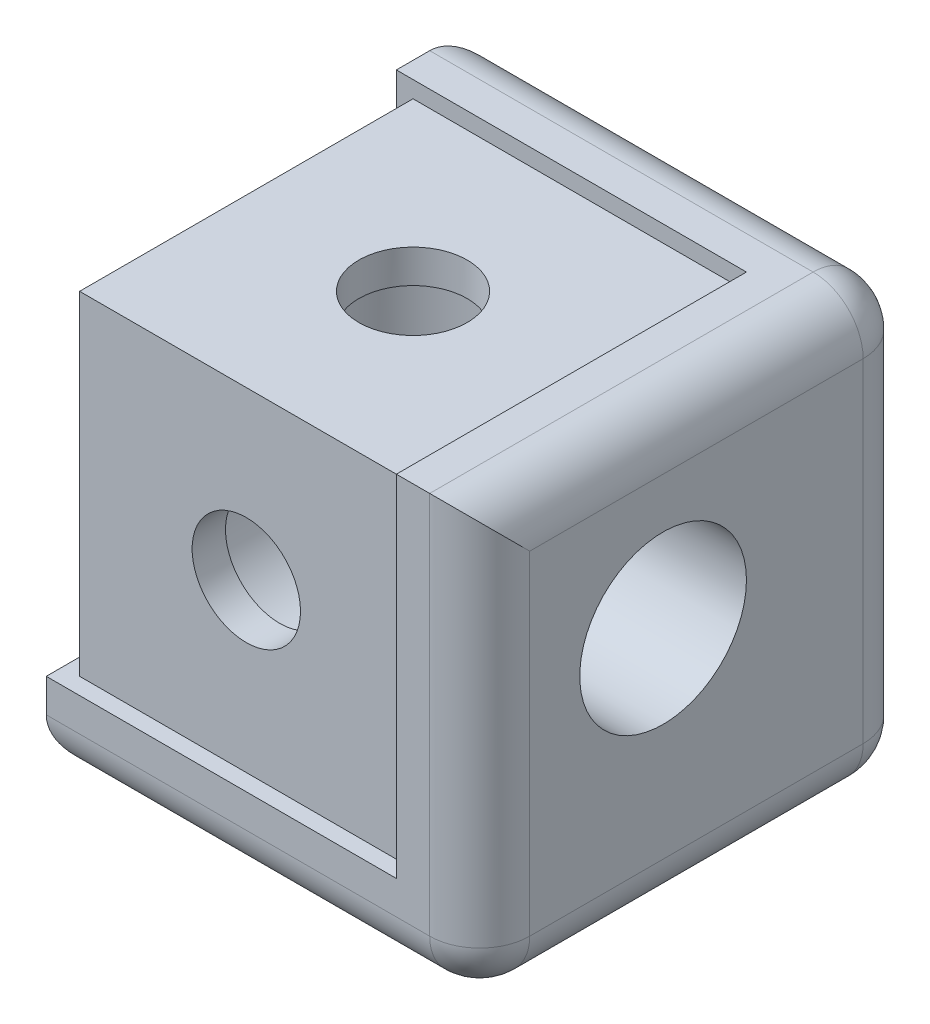
ISO-10303-21;
HEADER;
FILE_DESCRIPTION(('STEP AP214'),'2;1');
FILE_NAME('part.step','',(''),(''),'','','');
FILE_SCHEMA(('AUTOMOTIVE_DESIGN { 1 0 10303 214 1 1 1 1 }'));
ENDSEC;
DATA;
#1=APPLICATION_CONTEXT('core data for automotive mechanical design processes');
#2=APPLICATION_PROTOCOL_DEFINITION('international standard','automotive_design',2000,#1);
#3=PRODUCT_CONTEXT('',#1,'mechanical');
#4=PRODUCT('Part','Part','',(#3));
#5=PRODUCT_RELATED_PRODUCT_CATEGORY('part','',(#4));
#6=PRODUCT_DEFINITION_FORMATION('','',#4);
#7=PRODUCT_DEFINITION_CONTEXT('part definition',#1,'design');
#8=PRODUCT_DEFINITION('design','',#6,#7);
#9=PRODUCT_DEFINITION_SHAPE('','',#8);
#10=(LENGTH_UNIT() NAMED_UNIT(*) SI_UNIT(.MILLI.,.METRE.));
#11=(NAMED_UNIT(*) PLANE_ANGLE_UNIT() SI_UNIT($,.RADIAN.));
#12=(NAMED_UNIT(*) SI_UNIT($,.STERADIAN.) SOLID_ANGLE_UNIT());
#13=UNCERTAINTY_MEASURE_WITH_UNIT(LENGTH_MEASURE(1.E-05),#10,'distance_accuracy_value','');
#14=(GEOMETRIC_REPRESENTATION_CONTEXT(3) GLOBAL_UNCERTAINTY_ASSIGNED_CONTEXT((#13)) GLOBAL_UNIT_ASSIGNED_CONTEXT((#10,
#11,#12)) REPRESENTATION_CONTEXT('',''));
#15=CARTESIAN_POINT('',(0.,0.,0.));
#16=DIRECTION('',(0.,0.,1.));
#17=DIRECTION('',(1.,0.,0.));
#18=AXIS2_PLACEMENT_3D('',#15,#16,#17);
#19=CARTESIAN_POINT('',(0.,25.,0.));
#20=DIRECTION('',(0.,-1.,0.));
#21=DIRECTION('',(0.,0.,-1.));
#22=AXIS2_PLACEMENT_3D('',#19,#20,#21);
#23=PLANE('',#22);
#24=CARTESIAN_POINT('',(10.,25.,-10.));
#25=DIRECTION('',(0.,1.,0.));
#26=DIRECTION('',(0.,0.,1.));
#27=AXIS2_PLACEMENT_3D('',#24,#25,#26);
#28=CIRCLE('',#27,3.25);
#29=CARTESIAN_POINT('',(10.,25.,-6.75));
#30=VERTEX_POINT('',#29);
#31=EDGE_CURVE('E278',#30,#30,#28,.T.);
#32=ORIENTED_EDGE('',*,*,#31,.F.);
#33=EDGE_LOOP('',(#32));
#34=FACE_BOUND('',#33,.T.);
#35=DIRECTION('',(0.,0.,1.));
#36=VECTOR('',#35,1.);
#37=CARTESIAN_POINT('',(20.,25.,0.));
#38=LINE('',#37,#36);
#39=CARTESIAN_POINT('',(20.,25.,-20.));
#40=VERTEX_POINT('',#39);
#41=CARTESIAN_POINT('',(20.,25.,0.));
#42=VERTEX_POINT('',#41);
#43=EDGE_CURVE('E212',#40,#42,#38,.T.);
#44=ORIENTED_EDGE('',*,*,#43,.F.);
#45=DIRECTION('',(1.,0.,0.));
#46=VECTOR('',#45,1.);
#47=CARTESIAN_POINT('',(20.,25.,-20.));
#48=LINE('',#47,#46);
#49=CARTESIAN_POINT('',(0.,25.,-20.));
#50=VERTEX_POINT('',#49);
#51=EDGE_CURVE('E181',#50,#40,#48,.T.);
#52=ORIENTED_EDGE('',*,*,#51,.F.);
#53=DIRECTION('',(0.,0.,1.));
#54=VECTOR('',#53,1.);
#55=CARTESIAN_POINT('',(0.,25.,0.));
#56=LINE('',#55,#54);
#57=CARTESIAN_POINT('',(0.,25.,0.));
#58=VERTEX_POINT('',#57);
#59=EDGE_CURVE('E281',#50,#58,#56,.T.);
#60=ORIENTED_EDGE('',*,*,#59,.T.);
#61=DIRECTION('',(1.,0.,0.));
#62=VECTOR('',#61,1.);
#63=CARTESIAN_POINT('',(0.,25.,0.));
#64=LINE('',#63,#62);
#65=EDGE_CURVE('E283',#58,#42,#64,.T.);
#66=ORIENTED_EDGE('',*,*,#65,.T.);
#67=EDGE_LOOP('',(#44,#52,#60,#66));
#68=FACE_BOUND('',#67,.T.);
#69=ADVANCED_FACE('F35',(#34,#68),#23,.F.);
#70=CARTESIAN_POINT('',(0.,25.,0.));
#71=DIRECTION('',(0.,0.,-1.));
#72=DIRECTION('',(-1.,0.,0.));
#73=AXIS2_PLACEMENT_3D('',#70,#71,#72);
#74=PLANE('',#73);
#75=CARTESIAN_POINT('',(10.,15.,0.));
#76=DIRECTION('',(0.,0.,1.));
#77=DIRECTION('',(1.,0.,0.));
#78=AXIS2_PLACEMENT_3D('',#75,#76,#77);
#79=CIRCLE('',#78,3.25);
#80=CARTESIAN_POINT('',(13.25,15.,0.));
#81=VERTEX_POINT('',#80);
#82=EDGE_CURVE('E272',#81,#81,#79,.T.);
#83=ORIENTED_EDGE('',*,*,#82,.F.);
#84=EDGE_LOOP('',(#83));
#85=FACE_BOUND('',#84,.T.);
#86=DIRECTION('',(-1.,0.,0.));
#87=VECTOR('',#86,1.);
#88=CARTESIAN_POINT('',(20.,5.,0.));
#89=LINE('',#88,#87);
#90=CARTESIAN_POINT('',(20.,5.,0.));
#91=VERTEX_POINT('',#90);
#92=CARTESIAN_POINT('',(0.,5.,0.));
#93=VERTEX_POINT('',#92);
#94=EDGE_CURVE('E225',#91,#93,#89,.T.);
#95=ORIENTED_EDGE('',*,*,#94,.F.);
#96=DIRECTION('',(0.,-1.,0.));
#97=VECTOR('',#96,1.);
#98=CARTESIAN_POINT('',(20.,25.,0.));
#99=LINE('',#98,#97);
#100=EDGE_CURVE('E221',#42,#91,#99,.T.);
#101=ORIENTED_EDGE('',*,*,#100,.F.);
#102=ORIENTED_EDGE('',*,*,#65,.F.);
#103=DIRECTION('',(0.,-1.,0.));
#104=VECTOR('',#103,1.);
#105=CARTESIAN_POINT('',(0.,25.,0.));
#106=LINE('',#105,#104);
#107=EDGE_CURVE('E286',#58,#93,#106,.T.);
#108=ORIENTED_EDGE('',*,*,#107,.T.);
#109=EDGE_LOOP('',(#95,#101,#102,#108));
#110=FACE_BOUND('',#109,.T.);
#111=ADVANCED_FACE('F410',(#85,#110),#74,.F.);
#112=CARTESIAN_POINT('',(10.,0.,-10.));
#113=DIRECTION('',(0.,1.,0.));
#114=DIRECTION('',(0.,0.,1.));
#115=AXIS2_PLACEMENT_3D('',#112,#113,#114);
#116=CYLINDRICAL_SURFACE('',#115,3.25);
#117=ORIENTED_EDGE('',*,*,#31,.T.);
#118=EDGE_LOOP('',(#117));
#119=FACE_BOUND('',#118,.T.);
#120=CARTESIAN_POINT('',(10.,23.,-10.));
#121=DIRECTION('',(0.,-1.,0.));
#122=DIRECTION('',(0.,0.,-1.));
#123=AXIS2_PLACEMENT_3D('',#120,#121,#122);
#124=CIRCLE('',#123,3.25);
#125=CARTESIAN_POINT('',(10.,23.,-13.25));
#126=VERTEX_POINT('',#125);
#127=EDGE_CURVE('E257',#126,#126,#124,.F.);
#128=ORIENTED_EDGE('',*,*,#127,.F.);
#129=EDGE_LOOP('',(#128));
#130=FACE_BOUND('',#129,.T.);
#131=ADVANCED_FACE('F475',(#119,#130),#116,.F.);
#132=CARTESIAN_POINT('',(25.,15.,-10.));
#133=DIRECTION('',(-1.,0.,0.));
#134=DIRECTION('',(0.,0.,1.));
#135=AXIS2_PLACEMENT_3D('',#132,#133,#134);
#136=CYLINDRICAL_SURFACE('',#135,3.25);
#137=CARTESIAN_POINT('',(0.,15.,-10.));
#138=DIRECTION('',(-1.,0.,0.));
#139=DIRECTION('',(0.,0.,1.));
#140=AXIS2_PLACEMENT_3D('',#137,#138,#139);
#141=CIRCLE('',#140,3.25);
#142=CARTESIAN_POINT('',(0.,15.,-6.75));
#143=VERTEX_POINT('',#142);
#144=EDGE_CURVE('E275',#143,#143,#141,.T.);
#145=ORIENTED_EDGE('',*,*,#144,.T.);
#146=EDGE_LOOP('',(#145));
#147=FACE_BOUND('',#146,.T.);
#148=CARTESIAN_POINT('',(2.,15.,-10.));
#149=DIRECTION('',(1.,0.,0.));
#150=DIRECTION('',(0.,0.,-1.));
#151=AXIS2_PLACEMENT_3D('',#148,#149,#150);
#152=CIRCLE('',#151,3.25);
#153=CARTESIAN_POINT('',(2.,15.,-13.25));
#154=VERTEX_POINT('',#153);
#155=EDGE_CURVE('E261',#154,#154,#152,.F.);
#156=ORIENTED_EDGE('',*,*,#155,.F.);
#157=EDGE_LOOP('',(#156));
#158=FACE_BOUND('',#157,.T.);
#159=ADVANCED_FACE('F724',(#147,#158),#136,.F.);
#160=CARTESIAN_POINT('',(10.,15.,-2.00000000000001));
#161=DIRECTION('',(0.,0.,-1.));
#162=DIRECTION('',(-1.,0.,0.));
#163=AXIS2_PLACEMENT_3D('',#160,#161,#162);
#164=CYLINDRICAL_SURFACE('',#163,5.);
#165=CARTESIAN_POINT('',(10.,15.,-25.));
#166=DIRECTION('',(0.,0.,-1.));
#167=DIRECTION('',(-1.,0.,0.));
#168=AXIS2_PLACEMENT_3D('',#165,#166,#167);
#169=CIRCLE('',#168,5.);
#170=CARTESIAN_POINT('',(5.,15.,-25.));
#171=VERTEX_POINT('',#170);
#172=EDGE_CURVE('E269',#171,#171,#169,.T.);
#173=ORIENTED_EDGE('',*,*,#172,.T.);
#174=EDGE_LOOP('',(#173));
#175=FACE_BOUND('',#174,.T.);
#176=CARTESIAN_POINT('',(10.,15.,-10.));
#177=DIRECTION('',(-0.707106781186547,0.,-0.707106781186547));
#178=DIRECTION('',(0.707106781186547,0.,-0.707106781186547));
#179=AXIS2_PLACEMENT_3D('',#176,#177,#178);
#180=ELLIPSE('',#179,7.07106781186547,5.);
#181=CARTESIAN_POINT('',(13.5355339059327,11.4644660940673,-13.5355339059327));
#182=VERTEX_POINT('',#181);
#183=CARTESIAN_POINT('',(13.5355339059327,18.5355339059327,-13.5355339059327));
#184=VERTEX_POINT('',#183);
#185=EDGE_CURVE('E289',#182,#184,#180,.F.);
#186=ORIENTED_EDGE('',*,*,#185,.T.);
#187=CARTESIAN_POINT('',(10.,15.,-10.));
#188=DIRECTION('',(0.,-0.707106781186547,-0.707106781186547));
#189=DIRECTION('',(0.,0.707106781186547,-0.707106781186547));
#190=AXIS2_PLACEMENT_3D('',#187,#188,#189);
#191=ELLIPSE('',#190,7.07106781186548,5.);
#192=CARTESIAN_POINT('',(6.46446609406726,18.5355339059327,-13.5355339059327));
#193=VERTEX_POINT('',#192);
#194=EDGE_CURVE('E242',#184,#193,#191,.F.);
#195=ORIENTED_EDGE('',*,*,#194,.T.);
#196=CARTESIAN_POINT('',(10.,15.,-10.));
#197=DIRECTION('',(0.707106781186547,0.,-0.707106781186547));
#198=DIRECTION('',(-0.707106781186547,0.,-0.707106781186547));
#199=AXIS2_PLACEMENT_3D('',#196,#197,#198);
#200=ELLIPSE('',#199,7.07106781186547,5.);
#201=CARTESIAN_POINT('',(6.46446609406726,11.4644660940673,-13.5355339059327));
#202=VERTEX_POINT('',#201);
#203=EDGE_CURVE('E300',#193,#202,#200,.F.);
#204=ORIENTED_EDGE('',*,*,#203,.T.);
#205=CARTESIAN_POINT('',(10.,15.,-10.));
#206=DIRECTION('',(0.,0.707106781186547,-0.707106781186547));
#207=DIRECTION('',(0.,-0.707106781186547,-0.707106781186547));
#208=AXIS2_PLACEMENT_3D('',#205,#206,#207);
#209=ELLIPSE('',#208,7.07106781186548,5.);
#210=EDGE_CURVE('E251',#202,#182,#209,.F.);
#211=ORIENTED_EDGE('',*,*,#210,.T.);
#212=EDGE_LOOP('',(#186,#195,#204,#211));
#213=FACE_BOUND('',#212,.T.);
#214=ADVANCED_FACE('F714',(#175,#213),#164,.F.);
#215=CARTESIAN_POINT('',(10.,15.,-25.));
#216=DIRECTION('',(0.,0.,1.));
#217=DIRECTION('',(1.,0.,0.));
#218=AXIS2_PLACEMENT_3D('',#215,#216,#217);
#219=CYLINDRICAL_SURFACE('',#218,3.25);
#220=ORIENTED_EDGE('',*,*,#82,.T.);
#221=EDGE_LOOP('',(#220));
#222=FACE_BOUND('',#221,.T.);
#223=CARTESIAN_POINT('',(10.,15.,-2.00000000000001));
#224=DIRECTION('',(0.,0.,-1.));
#225=DIRECTION('',(-1.,0.,0.));
#226=AXIS2_PLACEMENT_3D('',#223,#224,#225);
#227=CIRCLE('',#226,3.25);
#228=CARTESIAN_POINT('',(6.75,15.,-2.00000000000001));
#229=VERTEX_POINT('',#228);
#230=EDGE_CURVE('E268',#229,#229,#227,.F.);
#231=ORIENTED_EDGE('',*,*,#230,.F.);
#232=EDGE_LOOP('',(#231));
#233=FACE_BOUND('',#232,.T.);
#234=ADVANCED_FACE('F491',(#222,#233),#219,.F.);
#235=CARTESIAN_POINT('',(0.,25.,0.));
#236=DIRECTION('',(1.,0.,0.));
#237=DIRECTION('',(0.,0.,-1.));
#238=AXIS2_PLACEMENT_3D('',#235,#236,#237);
#239=PLANE('',#238);
#240=ORIENTED_EDGE('',*,*,#144,.F.);
#241=EDGE_LOOP('',(#240));
#242=FACE_BOUND('',#241,.T.);
#243=DIRECTION('',(0.,-1.,0.));
#244=VECTOR('',#243,1.);
#245=CARTESIAN_POINT('',(0.,0.,-20.));
#246=LINE('',#245,#244);
#247=CARTESIAN_POINT('',(0.,5.,-20.));
#248=VERTEX_POINT('',#247);
#249=EDGE_CURVE('E204',#50,#248,#246,.T.);
#250=ORIENTED_EDGE('',*,*,#249,.T.);
#251=DIRECTION('',(0.,0.,1.));
#252=VECTOR('',#251,1.);
#253=CARTESIAN_POINT('',(0.,5.,0.));
#254=LINE('',#253,#252);
#255=EDGE_CURVE('E177',#248,#93,#254,.T.);
#256=ORIENTED_EDGE('',*,*,#255,.T.);
#257=ORIENTED_EDGE('',*,*,#107,.F.);
#258=ORIENTED_EDGE('',*,*,#59,.F.);
#259=EDGE_LOOP('',(#250,#256,#257,#258));
#260=FACE_BOUND('',#259,.T.);
#261=ADVANCED_FACE('F416',(#242,#260),#239,.F.);
#262=CARTESIAN_POINT('',(25.,25.,0.));
#263=DIRECTION('',(-1.,0.,0.));
#264=DIRECTION('',(0.,0.,1.));
#265=AXIS2_PLACEMENT_3D('',#262,#263,#264);
#266=PLANE('',#265);
#267=DIRECTION('',(0.,0.,-1.));
#268=VECTOR('',#267,1.);
#269=CARTESIAN_POINT('',(25.,23.,1.));
#270=LINE('',#269,#268);
#271=CARTESIAN_POINT('',(25.,23.,-22.));
#272=VERTEX_POINT('',#271);
#273=CARTESIAN_POINT('',(25.,23.,-2.));
#274=VERTEX_POINT('',#273);
#275=EDGE_CURVE('E320',#272,#274,#270,.F.);
#276=ORIENTED_EDGE('',*,*,#275,.T.);
#277=DIRECTION('',(0.,1.,0.));
#278=VECTOR('',#277,1.);
#279=CARTESIAN_POINT('',(25.,0.,-2.));
#280=LINE('',#279,#278);
#281=CARTESIAN_POINT('',(25.,3.,-2.));
#282=VERTEX_POINT('',#281);
#283=EDGE_CURVE('E322',#274,#282,#280,.F.);
#284=ORIENTED_EDGE('',*,*,#283,.T.);
#285=DIRECTION('',(0.,0.,-1.));
#286=VECTOR('',#285,1.);
#287=CARTESIAN_POINT('',(25.,3.,-25.));
#288=LINE('',#287,#286);
#289=CARTESIAN_POINT('',(25.,3.,-22.));
#290=VERTEX_POINT('',#289);
#291=EDGE_CURVE('E318',#282,#290,#288,.T.);
#292=ORIENTED_EDGE('',*,*,#291,.T.);
#293=DIRECTION('',(0.,-1.,0.));
#294=VECTOR('',#293,1.);
#295=CARTESIAN_POINT('',(25.,25.,-22.));
#296=LINE('',#295,#294);
#297=EDGE_CURVE('E316',#290,#272,#296,.F.);
#298=ORIENTED_EDGE('',*,*,#297,.T.);
#299=EDGE_LOOP('',(#276,#284,#292,#298));
#300=FACE_BOUND('',#299,.T.);
#301=CARTESIAN_POINT('',(25.,15.,-10.));
#302=DIRECTION('',(1.,0.,0.));
#303=DIRECTION('',(0.,0.,-1.));
#304=AXIS2_PLACEMENT_3D('',#301,#302,#303);
#305=CIRCLE('',#304,4.99999999999999);
#306=CARTESIAN_POINT('',(25.,15.,-15.));
#307=VERTEX_POINT('',#306);
#308=EDGE_CURVE('E262',#307,#307,#305,.T.);
#309=ORIENTED_EDGE('',*,*,#308,.F.);
#310=EDGE_LOOP('',(#309));
#311=FACE_BOUND('',#310,.T.);
#312=ADVANCED_FACE('F430',(#300,#311),#266,.F.);
#313=CARTESIAN_POINT('',(0.,25.,-25.));
#314=DIRECTION('',(0.,0.,1.));
#315=DIRECTION('',(1.,0.,0.));
#316=AXIS2_PLACEMENT_3D('',#313,#314,#315);
#317=PLANE('',#316);
#318=DIRECTION('',(-1.,0.,0.));
#319=VECTOR('',#318,1.);
#320=CARTESIAN_POINT('',(-1.,3.,-25.));
#321=LINE('',#320,#319);
#322=CARTESIAN_POINT('',(22.,3.,-25.));
#323=VERTEX_POINT('',#322);
#324=CARTESIAN_POINT('',(2.,3.,-25.));
#325=VERTEX_POINT('',#324);
#326=EDGE_CURVE('E340',#323,#325,#321,.T.);
#327=ORIENTED_EDGE('',*,*,#326,.T.);
#328=DIRECTION('',(0.,-1.,0.));
#329=VECTOR('',#328,1.);
#330=CARTESIAN_POINT('',(2.,26.,-25.));
#331=LINE('',#330,#329);
#332=CARTESIAN_POINT('',(2.,23.,-25.));
#333=VERTEX_POINT('',#332);
#334=EDGE_CURVE('E343',#325,#333,#331,.F.);
#335=ORIENTED_EDGE('',*,*,#334,.T.);
#336=DIRECTION('',(-1.,0.,0.));
#337=VECTOR('',#336,1.);
#338=CARTESIAN_POINT('',(25.,23.,-25.));
#339=LINE('',#338,#337);
#340=CARTESIAN_POINT('',(22.,23.,-25.));
#341=VERTEX_POINT('',#340);
#342=EDGE_CURVE('E58',#333,#341,#339,.F.);
#343=ORIENTED_EDGE('',*,*,#342,.T.);
#344=DIRECTION('',(0.,-1.,0.));
#345=VECTOR('',#344,1.);
#346=CARTESIAN_POINT('',(22.,25.,-25.));
#347=LINE('',#346,#345);
#348=EDGE_CURVE('E338',#341,#323,#347,.T.);
#349=ORIENTED_EDGE('',*,*,#348,.T.);
#350=EDGE_LOOP('',(#327,#335,#343,#349));
#351=FACE_BOUND('',#350,.T.);
#352=ORIENTED_EDGE('',*,*,#172,.F.);
#353=EDGE_LOOP('',(#352));
#354=FACE_BOUND('',#353,.T.);
#355=ADVANCED_FACE('F453',(#351,#354),#317,.F.);
#356=CARTESIAN_POINT('',(0.,0.,0.));
#357=DIRECTION('',(0.,-1.,0.));
#358=DIRECTION('',(0.,0.,-1.));
#359=AXIS2_PLACEMENT_3D('',#356,#357,#358);
#360=PLANE('',#359);
#361=DIRECTION('',(0.,0.,-1.));
#362=VECTOR('',#361,1.);
#363=CARTESIAN_POINT('',(22.,0.,1.));
#364=LINE('',#363,#362);
#365=CARTESIAN_POINT('',(22.,0.,-22.));
#366=VERTEX_POINT('',#365);
#367=CARTESIAN_POINT('',(22.,0.,-2.));
#368=VERTEX_POINT('',#367);
#369=EDGE_CURVE('E325',#366,#368,#364,.F.);
#370=ORIENTED_EDGE('',*,*,#369,.T.);
#371=DIRECTION('',(1.,0.,0.));
#372=VECTOR('',#371,1.);
#373=CARTESIAN_POINT('',(0.,0.,-2.));
#374=LINE('',#373,#372);
#375=CARTESIAN_POINT('',(2.,0.,-2.));
#376=VERTEX_POINT('',#375);
#377=EDGE_CURVE('E331',#368,#376,#374,.F.);
#378=ORIENTED_EDGE('',*,*,#377,.T.);
#379=DIRECTION('',(0.,0.,1.));
#380=VECTOR('',#379,1.);
#381=CARTESIAN_POINT('',(2.,0.,0.));
#382=LINE('',#381,#380);
#383=CARTESIAN_POINT('',(2.,0.,-22.));
#384=VERTEX_POINT('',#383);
#385=EDGE_CURVE('E329',#376,#384,#382,.F.);
#386=ORIENTED_EDGE('',*,*,#385,.T.);
#387=DIRECTION('',(-1.,0.,0.));
#388=VECTOR('',#387,1.);
#389=CARTESIAN_POINT('',(25.,0.,-22.));
#390=LINE('',#389,#388);
#391=EDGE_CURVE('E327',#384,#366,#390,.F.);
#392=ORIENTED_EDGE('',*,*,#391,.T.);
#393=EDGE_LOOP('',(#370,#378,#386,#392));
#394=FACE_BOUND('',#393,.T.);
#395=CARTESIAN_POINT('',(10.,0.,-10.));
#396=DIRECTION('',(0.,-1.,0.));
#397=DIRECTION('',(0.,0.,-1.));
#398=AXIS2_PLACEMENT_3D('',#395,#396,#397);
#399=CIRCLE('',#398,5.);
#400=CARTESIAN_POINT('',(10.,0.,-15.));
#401=VERTEX_POINT('',#400);
#402=EDGE_CURVE('E233',#401,#401,#399,.T.);
#403=ORIENTED_EDGE('',*,*,#402,.F.);
#404=EDGE_LOOP('',(#403));
#405=FACE_BOUND('',#404,.T.);
#406=ADVANCED_FACE('F456',(#394,#405),#360,.T.);
#407=CARTESIAN_POINT('',(10.,15.,-10.));
#408=DIRECTION('',(0.707106781186547,0.,-0.707106781186547));
#409=DIRECTION('',(-0.707106781186547,0.,-0.707106781186547));
#410=AXIS2_PLACEMENT_3D('',#407,#408,#409);
#411=ELLIPSE('',#410,7.07106781186547,5.);
#412=CARTESIAN_POINT('',(13.5355339059327,18.5355339059327,-6.46446609406726));
#413=VERTEX_POINT('',#412);
#414=CARTESIAN_POINT('',(13.5355339059327,11.4644660940673,-6.46446609406726));
#415=VERTEX_POINT('',#414);
#416=EDGE_CURVE('E297',#413,#415,#411,.T.);
#417=ORIENTED_EDGE('',*,*,#416,.T.);
#418=CARTESIAN_POINT('',(10.,15.,-10.));
#419=DIRECTION('',(0.,-0.707106781186547,-0.707106781186547));
#420=DIRECTION('',(0.,0.707106781186547,-0.707106781186547));
#421=AXIS2_PLACEMENT_3D('',#418,#419,#420);
#422=ELLIPSE('',#421,7.07106781186548,5.);
#423=CARTESIAN_POINT('',(6.46446609406726,11.4644660940673,-6.46446609406726));
#424=VERTEX_POINT('',#423);
#425=EDGE_CURVE('E248',#415,#424,#422,.T.);
#426=ORIENTED_EDGE('',*,*,#425,.T.);
#427=CARTESIAN_POINT('',(10.,15.,-10.));
#428=DIRECTION('',(-0.707106781186547,0.,-0.707106781186547));
#429=DIRECTION('',(0.707106781186547,0.,-0.707106781186547));
#430=AXIS2_PLACEMENT_3D('',#427,#428,#429);
#431=ELLIPSE('',#430,7.07106781186547,5.);
#432=CARTESIAN_POINT('',(6.46446609406726,18.5355339059327,-6.46446609406726));
#433=VERTEX_POINT('',#432);
#434=EDGE_CURVE('E294',#424,#433,#431,.T.);
#435=ORIENTED_EDGE('',*,*,#434,.T.);
#436=CARTESIAN_POINT('',(10.,15.,-10.));
#437=DIRECTION('',(0.,0.707106781186547,-0.707106781186547));
#438=DIRECTION('',(0.,-0.707106781186547,-0.707106781186547));
#439=AXIS2_PLACEMENT_3D('',#436,#437,#438);
#440=ELLIPSE('',#439,7.07106781186548,5.);
#441=EDGE_CURVE('E237',#433,#413,#440,.T.);
#442=ORIENTED_EDGE('',*,*,#441,.T.);
#443=EDGE_LOOP('',(#417,#426,#435,#442));
#444=FACE_BOUND('',#443,.T.);
#445=CARTESIAN_POINT('',(10.,15.,-2.00000000000001));
#446=DIRECTION('',(0.,0.,-1.));
#447=DIRECTION('',(-1.,0.,0.));
#448=AXIS2_PLACEMENT_3D('',#445,#446,#447);
#449=CIRCLE('',#448,5.);
#450=CARTESIAN_POINT('',(5.,15.,-2.00000000000001));
#451=VERTEX_POINT('',#450);
#452=EDGE_CURVE('E265',#451,#451,#449,.T.);
#453=ORIENTED_EDGE('',*,*,#452,.F.);
#454=EDGE_LOOP('',(#453));
#455=FACE_BOUND('',#454,.T.);
#456=ADVANCED_FACE('F484',(#444,#455),#164,.F.);
#457=CARTESIAN_POINT('',(10.,15.,-2.00000000000001));
#458=DIRECTION('',(0.,0.,-1.));
#459=DIRECTION('',(-1.,0.,0.));
#460=AXIS2_PLACEMENT_3D('',#457,#458,#459);
#461=PLANE('',#460);
#462=ORIENTED_EDGE('',*,*,#452,.T.);
#463=EDGE_LOOP('',(#462));
#464=FACE_BOUND('',#463,.T.);
#465=ORIENTED_EDGE('',*,*,#230,.T.);
#466=EDGE_LOOP('',(#465));
#467=FACE_BOUND('',#466,.T.);
#468=ADVANCED_FACE('F699',(#464,#467),#461,.T.);
#469=CARTESIAN_POINT('',(2.,15.,-10.));
#470=DIRECTION('',(1.,0.,0.));
#471=DIRECTION('',(0.,0.,-1.));
#472=AXIS2_PLACEMENT_3D('',#469,#470,#471);
#473=CYLINDRICAL_SURFACE('',#472,4.99999999999999);
#474=ORIENTED_EDGE('',*,*,#308,.T.);
#475=EDGE_LOOP('',(#474));
#476=FACE_BOUND('',#475,.T.);
#477=ORIENTED_EDGE('',*,*,#416,.F.);
#478=CARTESIAN_POINT('',(10.,15.,-10.));
#479=DIRECTION('',(0.707106781186547,-0.707106781186547,0.));
#480=DIRECTION('',(0.707106781186547,0.707106781186547,0.));
#481=AXIS2_PLACEMENT_3D('',#478,#479,#480);
#482=ELLIPSE('',#481,7.07106781186547,5.);
#483=EDGE_CURVE('E245',#413,#184,#482,.F.);
#484=ORIENTED_EDGE('',*,*,#483,.T.);
#485=ORIENTED_EDGE('',*,*,#185,.F.);
#486=CARTESIAN_POINT('',(10.,15.,-10.));
#487=DIRECTION('',(0.707106781186547,0.707106781186547,0.));
#488=DIRECTION('',(0.707106781186547,-0.707106781186547,0.));
#489=AXIS2_PLACEMENT_3D('',#486,#487,#488);
#490=ELLIPSE('',#489,7.07106781186547,5.);
#491=EDGE_CURVE('E254',#182,#415,#490,.F.);
#492=ORIENTED_EDGE('',*,*,#491,.T.);
#493=EDGE_LOOP('',(#477,#484,#485,#492));
#494=FACE_BOUND('',#493,.T.);
#495=ADVANCED_FACE('F684',(#476,#494),#473,.F.);
#496=CARTESIAN_POINT('',(2.,15.,-10.));
#497=DIRECTION('',(1.,0.,0.));
#498=DIRECTION('',(0.,0.,-1.));
#499=AXIS2_PLACEMENT_3D('',#496,#497,#498);
#500=PLANE('',#499);
#501=CARTESIAN_POINT('',(2.,15.,-10.));
#502=DIRECTION('',(1.,0.,0.));
#503=DIRECTION('',(0.,0.,-1.));
#504=AXIS2_PLACEMENT_3D('',#501,#502,#503);
#505=CIRCLE('',#504,4.99999999999999);
#506=CARTESIAN_POINT('',(2.,15.,-15.));
#507=VERTEX_POINT('',#506);
#508=EDGE_CURVE('E258',#507,#507,#505,.T.);
#509=ORIENTED_EDGE('',*,*,#508,.T.);
#510=EDGE_LOOP('',(#509));
#511=FACE_BOUND('',#510,.T.);
#512=ORIENTED_EDGE('',*,*,#155,.T.);
#513=EDGE_LOOP('',(#512));
#514=FACE_BOUND('',#513,.T.);
#515=ADVANCED_FACE('F681',(#511,#514),#500,.T.);
#516=ORIENTED_EDGE('',*,*,#508,.F.);
#517=EDGE_LOOP('',(#516));
#518=FACE_BOUND('',#517,.T.);
#519=ORIENTED_EDGE('',*,*,#434,.F.);
#520=CARTESIAN_POINT('',(10.,15.,-10.));
#521=DIRECTION('',(0.707106781186547,-0.707106781186547,0.));
#522=DIRECTION('',(0.707106781186547,0.707106781186547,0.));
#523=AXIS2_PLACEMENT_3D('',#520,#521,#522);
#524=ELLIPSE('',#523,7.07106781186547,5.);
#525=EDGE_CURVE('E206',#424,#202,#524,.T.);
#526=ORIENTED_EDGE('',*,*,#525,.T.);
#527=ORIENTED_EDGE('',*,*,#203,.F.);
#528=CARTESIAN_POINT('',(10.,15.,-10.));
#529=DIRECTION('',(0.707106781186547,0.707106781186547,0.));
#530=DIRECTION('',(0.707106781186547,-0.707106781186547,0.));
#531=AXIS2_PLACEMENT_3D('',#528,#529,#530);
#532=ELLIPSE('',#531,7.07106781186547,5.);
#533=EDGE_CURVE('E303',#193,#433,#532,.T.);
#534=ORIENTED_EDGE('',*,*,#533,.T.);
#535=EDGE_LOOP('',(#519,#526,#527,#534));
#536=FACE_BOUND('',#535,.T.);
#537=ADVANCED_FACE('F674',(#518,#536),#473,.F.);
#538=CARTESIAN_POINT('',(10.,23.,-10.));
#539=DIRECTION('',(0.,-1.,0.));
#540=DIRECTION('',(0.,0.,-1.));
#541=AXIS2_PLACEMENT_3D('',#538,#539,#540);
#542=CYLINDRICAL_SURFACE('',#541,5.);
#543=CARTESIAN_POINT('',(10.,23.,-10.));
#544=DIRECTION('',(0.,-1.,0.));
#545=DIRECTION('',(0.,0.,-1.));
#546=AXIS2_PLACEMENT_3D('',#543,#544,#545);
#547=CIRCLE('',#546,5.);
#548=CARTESIAN_POINT('',(10.,23.,-15.));
#549=VERTEX_POINT('',#548);
#550=EDGE_CURVE('E234',#549,#549,#547,.T.);
#551=ORIENTED_EDGE('',*,*,#550,.F.);
#552=EDGE_LOOP('',(#551));
#553=FACE_BOUND('',#552,.T.);
#554=ORIENTED_EDGE('',*,*,#441,.F.);
#555=ORIENTED_EDGE('',*,*,#533,.F.);
#556=ORIENTED_EDGE('',*,*,#194,.F.);
#557=ORIENTED_EDGE('',*,*,#483,.F.);
#558=EDGE_LOOP('',(#554,#555,#556,#557));
#559=FACE_BOUND('',#558,.T.);
#560=ADVANCED_FACE('F661',(#553,#559),#542,.F.);
#561=CARTESIAN_POINT('',(10.,23.,-10.));
#562=DIRECTION('',(0.,-1.,0.));
#563=DIRECTION('',(0.,0.,-1.));
#564=AXIS2_PLACEMENT_3D('',#561,#562,#563);
#565=PLANE('',#564);
#566=ORIENTED_EDGE('',*,*,#550,.T.);
#567=EDGE_LOOP('',(#566));
#568=FACE_BOUND('',#567,.T.);
#569=ORIENTED_EDGE('',*,*,#127,.T.);
#570=EDGE_LOOP('',(#569));
#571=FACE_BOUND('',#570,.T.);
#572=ADVANCED_FACE('F658',(#568,#571),#565,.T.);
#573=ORIENTED_EDGE('',*,*,#402,.T.);
#574=EDGE_LOOP('',(#573));
#575=FACE_BOUND('',#574,.T.);
#576=ORIENTED_EDGE('',*,*,#210,.F.);
#577=ORIENTED_EDGE('',*,*,#525,.F.);
#578=ORIENTED_EDGE('',*,*,#425,.F.);
#579=ORIENTED_EDGE('',*,*,#491,.F.);
#580=EDGE_LOOP('',(#576,#577,#578,#579));
#581=FACE_BOUND('',#580,.T.);
#582=ADVANCED_FACE('F651',(#575,#581),#542,.F.);
#583=CARTESIAN_POINT('',(20.,25.,1.));
#584=DIRECTION('',(1.,0.,0.));
#585=DIRECTION('',(0.,1.,0.));
#586=AXIS2_PLACEMENT_3D('',#583,#584,#585);
#587=PLANE('',#586);
#588=ORIENTED_EDGE('',*,*,#100,.T.);
#589=DIRECTION('',(0.,0.,-1.));
#590=VECTOR('',#589,1.);
#591=CARTESIAN_POINT('',(20.,5.,1.));
#592=LINE('',#591,#590);
#593=CARTESIAN_POINT('',(20.,5.,1.));
#594=VERTEX_POINT('',#593);
#595=EDGE_CURVE('E227',#594,#91,#592,.T.);
#596=ORIENTED_EDGE('',*,*,#595,.F.);
#597=DIRECTION('',(0.,-1.,0.));
#598=VECTOR('',#597,1.);
#599=CARTESIAN_POINT('',(20.,25.,1.));
#600=LINE('',#599,#598);
#601=CARTESIAN_POINT('',(20.,26.,1.));
#602=VERTEX_POINT('',#601);
#603=EDGE_CURVE('E222',#602,#594,#600,.T.);
#604=ORIENTED_EDGE('',*,*,#603,.F.);
#605=DIRECTION('',(0.,0.,1.));
#606=VECTOR('',#605,1.);
#607=CARTESIAN_POINT('',(20.,26.,1.));
#608=LINE('',#607,#606);
#609=CARTESIAN_POINT('',(20.,26.,-20.));
#610=VERTEX_POINT('',#609);
#611=EDGE_CURVE('E208',#610,#602,#608,.T.);
#612=ORIENTED_EDGE('',*,*,#611,.F.);
#613=DIRECTION('',(0.,-1.,0.));
#614=VECTOR('',#613,1.);
#615=CARTESIAN_POINT('',(20.,26.,-20.));
#616=LINE('',#615,#614);
#617=EDGE_CURVE('E215',#610,#40,#616,.T.);
#618=ORIENTED_EDGE('',*,*,#617,.T.);
#619=ORIENTED_EDGE('',*,*,#43,.T.);
#620=EDGE_LOOP('',(#588,#596,#604,#612,#618,#619));
#621=FACE_BOUND('',#620,.T.);
#622=ADVANCED_FACE('F407',(#621),#587,.F.);
#623=CARTESIAN_POINT('',(20.,5.,1.));
#624=DIRECTION('',(0.,-1.,0.));
#625=DIRECTION('',(1.,0.,0.));
#626=AXIS2_PLACEMENT_3D('',#623,#624,#625);
#627=PLANE('',#626);
#628=ORIENTED_EDGE('',*,*,#94,.T.);
#629=ORIENTED_EDGE('',*,*,#255,.F.);
#630=DIRECTION('',(1.,0.,0.));
#631=VECTOR('',#630,1.);
#632=CARTESIAN_POINT('',(-1.,5.,-20.));
#633=LINE('',#632,#631);
#634=CARTESIAN_POINT('',(-1.,5.,-20.));
#635=VERTEX_POINT('',#634);
#636=EDGE_CURVE('E171',#635,#248,#633,.T.);
#637=ORIENTED_EDGE('',*,*,#636,.F.);
#638=DIRECTION('',(0.,0.,1.));
#639=VECTOR('',#638,1.);
#640=CARTESIAN_POINT('',(-1.,5.,0.));
#641=LINE('',#640,#639);
#642=CARTESIAN_POINT('',(-1.,5.,1.));
#643=VERTEX_POINT('',#642);
#644=EDGE_CURVE('E176',#635,#643,#641,.T.);
#645=ORIENTED_EDGE('',*,*,#644,.T.);
#646=DIRECTION('',(-1.,0.,0.));
#647=VECTOR('',#646,1.);
#648=CARTESIAN_POINT('',(20.,5.,1.));
#649=LINE('',#648,#647);
#650=EDGE_CURVE('E224',#594,#643,#649,.T.);
#651=ORIENTED_EDGE('',*,*,#650,.F.);
#652=ORIENTED_EDGE('',*,*,#595,.T.);
#653=EDGE_LOOP('',(#628,#629,#637,#645,#651,#652));
#654=FACE_BOUND('',#653,.T.);
#655=ADVANCED_FACE('F174',(#654),#627,.F.);
#656=CARTESIAN_POINT('',(0.,0.,1.));
#657=DIRECTION('',(0.,0.,1.));
#658=DIRECTION('',(1.,0.,0.));
#659=AXIS2_PLACEMENT_3D('',#656,#657,#658);
#660=PLANE('',#659);
#661=DIRECTION('',(1.,0.,0.));
#662=VECTOR('',#661,1.);
#663=CARTESIAN_POINT('',(0.,3.,1.));
#664=LINE('',#663,#662);
#665=CARTESIAN_POINT('',(-1.,3.,1.));
#666=VERTEX_POINT('',#665);
#667=CARTESIAN_POINT('',(22.,3.,1.));
#668=VERTEX_POINT('',#667);
#669=EDGE_CURVE('E205',#666,#668,#664,.T.);
#670=ORIENTED_EDGE('',*,*,#669,.T.);
#671=DIRECTION('',(0.,1.,0.));
#672=VECTOR('',#671,1.);
#673=CARTESIAN_POINT('',(22.,26.,1.));
#674=LINE('',#673,#672);
#675=CARTESIAN_POINT('',(22.,26.,1.));
#676=VERTEX_POINT('',#675);
#677=EDGE_CURVE('E313',#668,#676,#674,.T.);
#678=ORIENTED_EDGE('',*,*,#677,.T.);
#679=DIRECTION('',(1.,0.,0.));
#680=VECTOR('',#679,1.);
#681=CARTESIAN_POINT('',(25.,26.,1.));
#682=LINE('',#681,#680);
#683=EDGE_CURVE('E211',#602,#676,#682,.T.);
#684=ORIENTED_EDGE('',*,*,#683,.F.);
#685=ORIENTED_EDGE('',*,*,#603,.T.);
#686=ORIENTED_EDGE('',*,*,#650,.T.);
#687=DIRECTION('',(0.,1.,0.));
#688=VECTOR('',#687,1.);
#689=CARTESIAN_POINT('',(-1.,0.,1.));
#690=LINE('',#689,#688);
#691=EDGE_CURVE('E182',#666,#643,#690,.T.);
#692=ORIENTED_EDGE('',*,*,#691,.F.);
#693=EDGE_LOOP('',(#670,#678,#684,#685,#686,#692));
#694=FACE_BOUND('',#693,.T.);
#695=ADVANCED_FACE('F402',(#694),#660,.T.);
#696=CARTESIAN_POINT('',(20.,26.,-20.));
#697=DIRECTION('',(0.,0.,-1.));
#698=DIRECTION('',(-1.,0.,0.));
#699=AXIS2_PLACEMENT_3D('',#696,#697,#698);
#700=PLANE('',#699);
#701=ORIENTED_EDGE('',*,*,#51,.T.);
#702=ORIENTED_EDGE('',*,*,#617,.F.);
#703=DIRECTION('',(1.,0.,0.));
#704=VECTOR('',#703,1.);
#705=CARTESIAN_POINT('',(20.,26.,-20.));
#706=LINE('',#705,#704);
#707=CARTESIAN_POINT('',(-1.,26.,-20.));
#708=VERTEX_POINT('',#707);
#709=EDGE_CURVE('E196',#708,#610,#706,.T.);
#710=ORIENTED_EDGE('',*,*,#709,.F.);
#711=DIRECTION('',(0.,-1.,0.));
#712=VECTOR('',#711,1.);
#713=CARTESIAN_POINT('',(-1.,0.,-20.));
#714=LINE('',#713,#712);
#715=EDGE_CURVE('E188',#708,#635,#714,.T.);
#716=ORIENTED_EDGE('',*,*,#715,.T.);
#717=ORIENTED_EDGE('',*,*,#636,.T.);
#718=ORIENTED_EDGE('',*,*,#249,.F.);
#719=EDGE_LOOP('',(#701,#702,#710,#716,#717,#718));
#720=FACE_BOUND('',#719,.T.);
#721=ADVANCED_FACE('F193',(#720),#700,.F.);
#722=CARTESIAN_POINT('',(0.,26.,0.));
#723=DIRECTION('',(0.,1.,0.));
#724=DIRECTION('',(0.,0.,1.));
#725=AXIS2_PLACEMENT_3D('',#722,#723,#724);
#726=PLANE('',#725);
#727=DIRECTION('',(0.,0.,-1.));
#728=VECTOR('',#727,1.);
#729=CARTESIAN_POINT('',(22.,26.,-25.));
#730=LINE('',#729,#728);
#731=CARTESIAN_POINT('',(22.,26.,-22.));
#732=VERTEX_POINT('',#731);
#733=EDGE_CURVE('E44',#676,#732,#730,.T.);
#734=ORIENTED_EDGE('',*,*,#733,.T.);
#735=DIRECTION('',(-1.,0.,0.));
#736=VECTOR('',#735,1.);
#737=CARTESIAN_POINT('',(-1.,26.,-22.));
#738=LINE('',#737,#736);
#739=CARTESIAN_POINT('',(-1.,26.,-22.));
#740=VERTEX_POINT('',#739);
#741=EDGE_CURVE('E11',#732,#740,#738,.T.);
#742=ORIENTED_EDGE('',*,*,#741,.T.);
#743=DIRECTION('',(0.,0.,-1.));
#744=VECTOR('',#743,1.);
#745=CARTESIAN_POINT('',(-1.,26.,0.));
#746=LINE('',#745,#744);
#747=EDGE_CURVE('E198',#708,#740,#746,.T.);
#748=ORIENTED_EDGE('',*,*,#747,.F.);
#749=ORIENTED_EDGE('',*,*,#709,.T.);
#750=ORIENTED_EDGE('',*,*,#611,.T.);
#751=ORIENTED_EDGE('',*,*,#683,.T.);
#752=EDGE_LOOP('',(#734,#742,#748,#749,#750,#751));
#753=FACE_BOUND('',#752,.T.);
#754=ADVANCED_FACE('F417',(#753),#726,.T.);
#755=CARTESIAN_POINT('',(-1.,0.,0.));
#756=DIRECTION('',(-1.,0.,0.));
#757=DIRECTION('',(0.,0.,1.));
#758=AXIS2_PLACEMENT_3D('',#755,#756,#757);
#759=PLANE('',#758);
#760=DIRECTION('',(0.,-1.,0.));
#761=VECTOR('',#760,1.);
#762=CARTESIAN_POINT('',(-1.,0.,-22.));
#763=LINE('',#762,#761);
#764=CARTESIAN_POINT('',(-1.,3.,-22.));
#765=VERTEX_POINT('',#764);
#766=EDGE_CURVE('E334',#740,#765,#763,.T.);
#767=ORIENTED_EDGE('',*,*,#766,.T.);
#768=DIRECTION('',(0.,0.,1.));
#769=VECTOR('',#768,1.);
#770=CARTESIAN_POINT('',(-1.,3.,0.));
#771=LINE('',#770,#769);
#772=EDGE_CURVE('E336',#765,#666,#771,.T.);
#773=ORIENTED_EDGE('',*,*,#772,.T.);
#774=ORIENTED_EDGE('',*,*,#691,.T.);
#775=ORIENTED_EDGE('',*,*,#644,.F.);
#776=ORIENTED_EDGE('',*,*,#715,.F.);
#777=ORIENTED_EDGE('',*,*,#747,.T.);
#778=EDGE_LOOP('',(#767,#773,#774,#775,#776,#777));
#779=FACE_BOUND('',#778,.T.);
#780=ADVANCED_FACE('F186',(#779),#759,.T.);
#781=CARTESIAN_POINT('',(0.,3.,-22.));
#782=DIRECTION('',(1.,0.,0.));
#783=DIRECTION('',(0.,0.,-1.));
#784=AXIS2_PLACEMENT_3D('',#781,#782,#783);
#785=CYLINDRICAL_SURFACE('',#784,3.);
#786=CARTESIAN_POINT('',(2.,3.,-22.));
#787=DIRECTION('',(-1.,0.,0.));
#788=DIRECTION('',(0.,0.,1.));
#789=AXIS2_PLACEMENT_3D('',#786,#787,#788);
#790=CIRCLE('',#789,3.);
#791=EDGE_CURVE('E39',#325,#384,#790,.T.);
#792=ORIENTED_EDGE('',*,*,#791,.F.);
#793=ORIENTED_EDGE('',*,*,#326,.F.);
#794=CARTESIAN_POINT('',(22.,3.,-22.));
#795=DIRECTION('',(1.,0.,0.));
#796=DIRECTION('',(0.,0.,-1.));
#797=AXIS2_PLACEMENT_3D('',#794,#795,#796);
#798=CIRCLE('',#797,3.);
#799=EDGE_CURVE('E379',#366,#323,#798,.T.);
#800=ORIENTED_EDGE('',*,*,#799,.F.);
#801=ORIENTED_EDGE('',*,*,#391,.F.);
#802=EDGE_LOOP('',(#792,#793,#800,#801));
#803=FACE_BOUND('',#802,.T.);
#804=ADVANCED_FACE('F37',(#803),#785,.T.);
#805=CARTESIAN_POINT('',(2.,3.,-22.));
#806=DIRECTION('',(0.,0.,1.));
#807=DIRECTION('',(1.,0.,0.));
#808=AXIS2_PLACEMENT_3D('',#805,#806,#807);
#809=SPHERICAL_SURFACE('',#808,3.);
#810=CARTESIAN_POINT('',(2.,3.,-22.));
#811=DIRECTION('',(0.,0.,-1.));
#812=DIRECTION('',(-1.,0.,0.));
#813=AXIS2_PLACEMENT_3D('',#810,#811,#812);
#814=CIRCLE('',#813,3.);
#815=EDGE_CURVE('E376',#765,#384,#814,.F.);
#816=ORIENTED_EDGE('',*,*,#815,.F.);
#817=CARTESIAN_POINT('',(2.,3.,-22.));
#818=DIRECTION('',(0.,-1.,0.));
#819=DIRECTION('',(0.,0.,-1.));
#820=AXIS2_PLACEMENT_3D('',#817,#818,#819);
#821=CIRCLE('',#820,3.);
#822=EDGE_CURVE('E381',#325,#765,#821,.F.);
#823=ORIENTED_EDGE('',*,*,#822,.F.);
#824=ORIENTED_EDGE('',*,*,#791,.T.);
#825=EDGE_LOOP('',(#816,#823,#824));
#826=FACE_BOUND('',#825,.T.);
#827=ADVANCED_FACE('F391',(#826),#809,.T.);
#828=CARTESIAN_POINT('',(2.,0.,-22.));
#829=DIRECTION('',(0.,1.,0.));
#830=DIRECTION('',(0.,0.,1.));
#831=AXIS2_PLACEMENT_3D('',#828,#829,#830);
#832=CYLINDRICAL_SURFACE('',#831,3.);
#833=ORIENTED_EDGE('',*,*,#822,.T.);
#834=ORIENTED_EDGE('',*,*,#766,.F.);
#835=CARTESIAN_POINT('',(2.,23.,-22.));
#836=DIRECTION('',(0.707106781186547,0.707106781186547,0.));
#837=DIRECTION('',(0.707106781186547,-0.707106781186547,0.));
#838=AXIS2_PLACEMENT_3D('',#835,#836,#837);
#839=ELLIPSE('',#838,4.24264068711928,3.);
#840=EDGE_CURVE('E374',#333,#740,#839,.T.);
#841=ORIENTED_EDGE('',*,*,#840,.F.);
#842=ORIENTED_EDGE('',*,*,#334,.F.);
#843=EDGE_LOOP('',(#833,#834,#841,#842));
#844=FACE_BOUND('',#843,.T.);
#845=ADVANCED_FACE('F418',(#844),#832,.T.);
#846=CARTESIAN_POINT('',(22.,3.,-22.));
#847=DIRECTION('',(0.,0.,1.));
#848=DIRECTION('',(1.,0.,0.));
#849=AXIS2_PLACEMENT_3D('',#846,#847,#848);
#850=SPHERICAL_SURFACE('',#849,3.);
#851=CARTESIAN_POINT('',(22.,3.,-22.));
#852=DIRECTION('',(0.,0.,-1.));
#853=DIRECTION('',(-1.,0.,0.));
#854=AXIS2_PLACEMENT_3D('',#851,#852,#853);
#855=CIRCLE('',#854,3.);
#856=EDGE_CURVE('E368',#366,#290,#855,.F.);
#857=ORIENTED_EDGE('',*,*,#856,.F.);
#858=ORIENTED_EDGE('',*,*,#799,.T.);
#859=CARTESIAN_POINT('',(22.,3.,-22.));
#860=DIRECTION('',(0.,-1.,0.));
#861=DIRECTION('',(0.,0.,-1.));
#862=AXIS2_PLACEMENT_3D('',#859,#860,#861);
#863=CIRCLE('',#862,3.);
#864=EDGE_CURVE('E371',#290,#323,#863,.F.);
#865=ORIENTED_EDGE('',*,*,#864,.F.);
#866=EDGE_LOOP('',(#857,#858,#865));
#867=FACE_BOUND('',#866,.T.);
#868=ADVANCED_FACE('F447',(#867),#850,.T.);
#869=CARTESIAN_POINT('',(2.,3.,0.));
#870=DIRECTION('',(0.,0.,1.));
#871=DIRECTION('',(1.,0.,0.));
#872=AXIS2_PLACEMENT_3D('',#869,#870,#871);
#873=CYLINDRICAL_SURFACE('',#872,3.);
#874=ORIENTED_EDGE('',*,*,#815,.T.);
#875=ORIENTED_EDGE('',*,*,#385,.F.);
#876=CARTESIAN_POINT('',(2.,3.,-2.));
#877=DIRECTION('',(0.707106781186547,0.,0.707106781186547));
#878=DIRECTION('',(-0.707106781186547,0.,0.707106781186547));
#879=AXIS2_PLACEMENT_3D('',#876,#877,#878);
#880=ELLIPSE('',#879,4.24264068711928,3.);
#881=EDGE_CURVE('E366',#666,#376,#880,.T.);
#882=ORIENTED_EDGE('',*,*,#881,.F.);
#883=ORIENTED_EDGE('',*,*,#772,.F.);
#884=EDGE_LOOP('',(#874,#875,#882,#883));
#885=FACE_BOUND('',#884,.T.);
#886=ADVANCED_FACE('F398',(#885),#873,.T.);
#887=CARTESIAN_POINT('',(0.,23.,-22.));
#888=DIRECTION('',(1.,0.,0.));
#889=DIRECTION('',(0.,0.,-1.));
#890=AXIS2_PLACEMENT_3D('',#887,#888,#889);
#891=CYLINDRICAL_SURFACE('',#890,3.);
#892=ORIENTED_EDGE('',*,*,#840,.T.);
#893=ORIENTED_EDGE('',*,*,#741,.F.);
#894=CARTESIAN_POINT('',(22.,23.,-22.));
#895=DIRECTION('',(1.,0.,0.));
#896=DIRECTION('',(0.,0.,-1.));
#897=AXIS2_PLACEMENT_3D('',#894,#895,#896);
#898=CIRCLE('',#897,3.);
#899=EDGE_CURVE('E363',#341,#732,#898,.T.);
#900=ORIENTED_EDGE('',*,*,#899,.F.);
#901=ORIENTED_EDGE('',*,*,#342,.F.);
#902=EDGE_LOOP('',(#892,#893,#900,#901));
#903=FACE_BOUND('',#902,.T.);
#904=ADVANCED_FACE('F419',(#903),#891,.T.);
#905=CARTESIAN_POINT('',(22.,25.,-22.));
#906=DIRECTION('',(0.,-1.,0.));
#907=DIRECTION('',(0.,0.,-1.));
#908=AXIS2_PLACEMENT_3D('',#905,#906,#907);
#909=CYLINDRICAL_SURFACE('',#908,3.);
#910=ORIENTED_EDGE('',*,*,#864,.T.);
#911=ORIENTED_EDGE('',*,*,#348,.F.);
#912=CARTESIAN_POINT('',(22.,23.,-22.));
#913=DIRECTION('',(0.,1.,0.));
#914=DIRECTION('',(0.,0.,1.));
#915=AXIS2_PLACEMENT_3D('',#912,#913,#914);
#916=CIRCLE('',#915,3.);
#917=EDGE_CURVE('E360',#272,#341,#916,.T.);
#918=ORIENTED_EDGE('',*,*,#917,.F.);
#919=ORIENTED_EDGE('',*,*,#297,.F.);
#920=EDGE_LOOP('',(#910,#911,#918,#919));
#921=FACE_BOUND('',#920,.T.);
#922=ADVANCED_FACE('F451',(#921),#909,.T.);
#923=CARTESIAN_POINT('',(22.,3.,0.));
#924=DIRECTION('',(0.,0.,1.));
#925=DIRECTION('',(1.,0.,0.));
#926=AXIS2_PLACEMENT_3D('',#923,#924,#925);
#927=CYLINDRICAL_SURFACE('',#926,3.);
#928=ORIENTED_EDGE('',*,*,#856,.T.);
#929=ORIENTED_EDGE('',*,*,#291,.F.);
#930=CARTESIAN_POINT('',(22.,3.,-2.));
#931=DIRECTION('',(0.,0.,1.));
#932=DIRECTION('',(1.,0.,0.));
#933=AXIS2_PLACEMENT_3D('',#930,#931,#932);
#934=CIRCLE('',#933,3.);
#935=EDGE_CURVE('E357',#368,#282,#934,.T.);
#936=ORIENTED_EDGE('',*,*,#935,.F.);
#937=ORIENTED_EDGE('',*,*,#369,.F.);
#938=EDGE_LOOP('',(#928,#929,#936,#937));
#939=FACE_BOUND('',#938,.T.);
#940=ADVANCED_FACE('F443',(#939),#927,.T.);
#941=CARTESIAN_POINT('',(0.,3.,-2.));
#942=DIRECTION('',(1.,0.,0.));
#943=DIRECTION('',(0.,0.,-1.));
#944=AXIS2_PLACEMENT_3D('',#941,#942,#943);
#945=CYLINDRICAL_SURFACE('',#944,3.);
#946=ORIENTED_EDGE('',*,*,#881,.T.);
#947=ORIENTED_EDGE('',*,*,#377,.F.);
#948=CARTESIAN_POINT('',(22.,3.,-2.));
#949=DIRECTION('',(1.,0.,0.));
#950=DIRECTION('',(0.,0.,-1.));
#951=AXIS2_PLACEMENT_3D('',#948,#949,#950);
#952=CIRCLE('',#951,3.);
#953=EDGE_CURVE('E354',#668,#368,#952,.T.);
#954=ORIENTED_EDGE('',*,*,#953,.F.);
#955=ORIENTED_EDGE('',*,*,#669,.F.);
#956=EDGE_LOOP('',(#946,#947,#954,#955));
#957=FACE_BOUND('',#956,.T.);
#958=ADVANCED_FACE('F460',(#957),#945,.T.);
#959=CARTESIAN_POINT('',(22.,23.,-22.));
#960=DIRECTION('',(0.,0.,1.));
#961=DIRECTION('',(1.,0.,0.));
#962=AXIS2_PLACEMENT_3D('',#959,#960,#961);
#963=SPHERICAL_SURFACE('',#962,3.);
#964=ORIENTED_EDGE('',*,*,#917,.T.);
#965=ORIENTED_EDGE('',*,*,#899,.T.);
#966=CARTESIAN_POINT('',(22.,23.,-22.));
#967=DIRECTION('',(0.,0.,-1.));
#968=DIRECTION('',(-1.,0.,0.));
#969=AXIS2_PLACEMENT_3D('',#966,#967,#968);
#970=CIRCLE('',#969,3.);
#971=EDGE_CURVE('E351',#272,#732,#970,.F.);
#972=ORIENTED_EDGE('',*,*,#971,.F.);
#973=EDGE_LOOP('',(#964,#965,#972));
#974=FACE_BOUND('',#973,.T.);
#975=ADVANCED_FACE('F422',(#974),#963,.T.);
#976=CARTESIAN_POINT('',(22.,3.,-2.));
#977=DIRECTION('',(0.,0.,1.));
#978=DIRECTION('',(1.,0.,0.));
#979=AXIS2_PLACEMENT_3D('',#976,#977,#978);
#980=SPHERICAL_SURFACE('',#979,3.);
#981=ORIENTED_EDGE('',*,*,#953,.T.);
#982=ORIENTED_EDGE('',*,*,#935,.T.);
#983=CARTESIAN_POINT('',(22.,3.,-2.));
#984=DIRECTION('',(0.,-1.,0.));
#985=DIRECTION('',(0.,0.,-1.));
#986=AXIS2_PLACEMENT_3D('',#983,#984,#985);
#987=CIRCLE('',#986,3.);
#988=EDGE_CURVE('E349',#668,#282,#987,.F.);
#989=ORIENTED_EDGE('',*,*,#988,.F.);
#990=EDGE_LOOP('',(#981,#982,#989));
#991=FACE_BOUND('',#990,.T.);
#992=ADVANCED_FACE('F440',(#991),#980,.T.);
#993=CARTESIAN_POINT('',(22.,23.,0.));
#994=DIRECTION('',(0.,0.,1.));
#995=DIRECTION('',(1.,0.,0.));
#996=AXIS2_PLACEMENT_3D('',#993,#994,#995);
#997=CYLINDRICAL_SURFACE('',#996,3.);
#998=ORIENTED_EDGE('',*,*,#971,.T.);
#999=ORIENTED_EDGE('',*,*,#733,.F.);
#1000=CARTESIAN_POINT('',(22.,23.,-2.));
#1001=DIRECTION('',(0.,-0.707106781186547,0.707106781186547));
#1002=DIRECTION('',(0.,0.707106781186547,0.707106781186547));
#1003=AXIS2_PLACEMENT_3D('',#1000,#1001,#1002);
#1004=ELLIPSE('',#1003,4.24264068711928,3.);
#1005=EDGE_CURVE('E347',#274,#676,#1004,.T.);
#1006=ORIENTED_EDGE('',*,*,#1005,.F.);
#1007=ORIENTED_EDGE('',*,*,#275,.F.);
#1008=EDGE_LOOP('',(#998,#999,#1006,#1007));
#1009=FACE_BOUND('',#1008,.T.);
#1010=ADVANCED_FACE('F426',(#1009),#997,.T.);
#1011=CARTESIAN_POINT('',(22.,0.,-2.));
#1012=DIRECTION('',(0.,-1.,0.));
#1013=DIRECTION('',(0.,0.,-1.));
#1014=AXIS2_PLACEMENT_3D('',#1011,#1012,#1013);
#1015=CYLINDRICAL_SURFACE('',#1014,3.);
#1016=ORIENTED_EDGE('',*,*,#988,.T.);
#1017=ORIENTED_EDGE('',*,*,#283,.F.);
#1018=ORIENTED_EDGE('',*,*,#1005,.T.);
#1019=ORIENTED_EDGE('',*,*,#677,.F.);
#1020=EDGE_LOOP('',(#1016,#1017,#1018,#1019));
#1021=FACE_BOUND('',#1020,.T.);
#1022=ADVANCED_FACE('F434',(#1021),#1015,.T.);
#1023=CLOSED_SHELL('',(#69,#111,#131,#159,#214,#234,#261,#312,#355,#406,#456,#468,#495,#515,
#537,#560,#572,#582,#622,#655,#695,#721,#754,#780,#804,#827,#845,#868,#886,#904,#922,#940,#958,
#975,#992,#1010,#1022));
#1024=MANIFOLD_SOLID_BREP('B2',#1023);
#1025=ADVANCED_BREP_SHAPE_REPRESENTATION('',(#18,#1024),#14);
#1026=SHAPE_DEFINITION_REPRESENTATION(#9,#1025);
ENDSEC;
END-ISO-10303-21;
